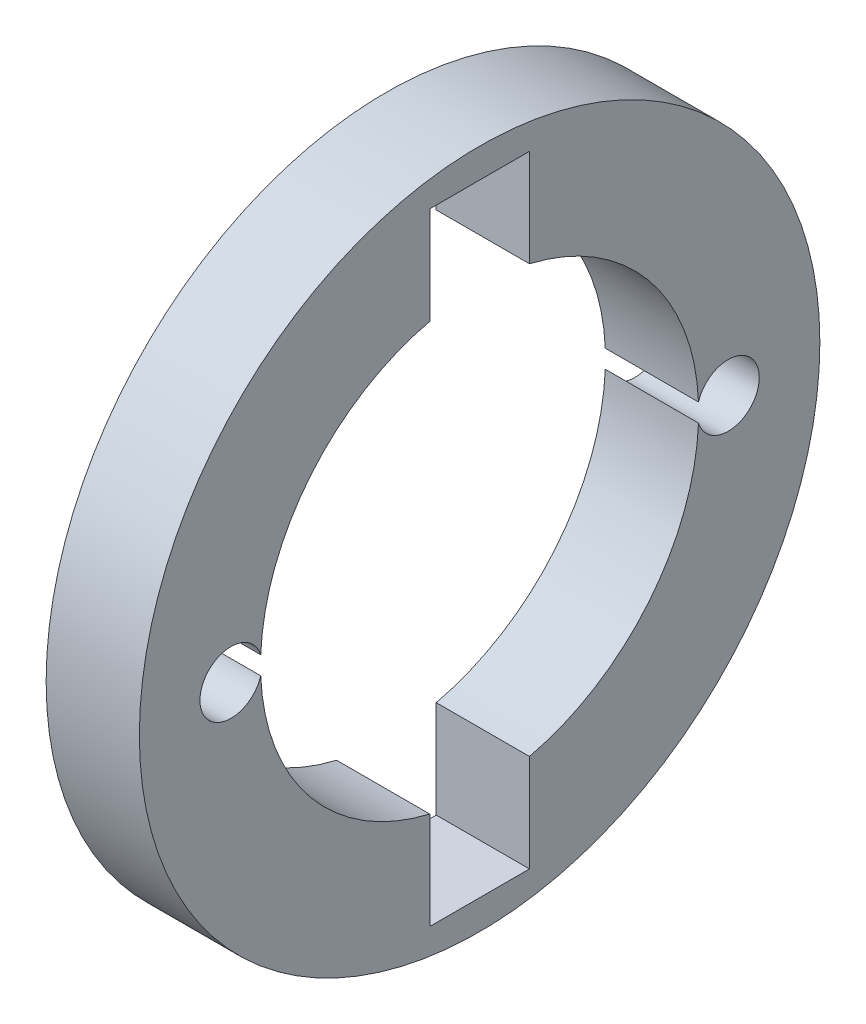
ISO-10303-21;
HEADER;
FILE_DESCRIPTION(('STEP AP214'),'2;1');
FILE_NAME('part.step','',(''),(''),'','','');
FILE_SCHEMA(('AUTOMOTIVE_DESIGN { 1 0 10303 214 1 1 1 1 }'));
ENDSEC;
DATA;
#1=APPLICATION_CONTEXT('core data for automotive mechanical design processes');
#2=APPLICATION_PROTOCOL_DEFINITION('international standard','automotive_design',2000,#1);
#3=PRODUCT_CONTEXT('',#1,'mechanical');
#4=PRODUCT('Part','Part','',(#3));
#5=PRODUCT_RELATED_PRODUCT_CATEGORY('part','',(#4));
#6=PRODUCT_DEFINITION_FORMATION('','',#4);
#7=PRODUCT_DEFINITION_CONTEXT('part definition',#1,'design');
#8=PRODUCT_DEFINITION('design','',#6,#7);
#9=PRODUCT_DEFINITION_SHAPE('','',#8);
#10=(LENGTH_UNIT() NAMED_UNIT(*) SI_UNIT(.MILLI.,.METRE.));
#11=(NAMED_UNIT(*) PLANE_ANGLE_UNIT() SI_UNIT($,.RADIAN.));
#12=(NAMED_UNIT(*) SI_UNIT($,.STERADIAN.) SOLID_ANGLE_UNIT());
#13=UNCERTAINTY_MEASURE_WITH_UNIT(LENGTH_MEASURE(1.E-05),#10,'distance_accuracy_value','');
#14=(GEOMETRIC_REPRESENTATION_CONTEXT(3) GLOBAL_UNCERTAINTY_ASSIGNED_CONTEXT((#13)) GLOBAL_UNIT_ASSIGNED_CONTEXT((#10,
#11,#12)) REPRESENTATION_CONTEXT('',''));
#15=CARTESIAN_POINT('',(0.,0.,0.));
#16=DIRECTION('',(0.,0.,1.));
#17=DIRECTION('',(1.,0.,0.));
#18=AXIS2_PLACEMENT_3D('',#15,#16,#17);
#19=CARTESIAN_POINT('',(-8.42,0.,0.));
#20=DIRECTION('',(1.,0.,0.));
#21=DIRECTION('',(0.,0.,-1.));
#22=AXIS2_PLACEMENT_3D('',#19,#20,#21);
#23=CYLINDRICAL_SURFACE('',#22,10.95);
#24=CARTESIAN_POINT('',(-8.42,0.,0.));
#25=DIRECTION('',(-1.,0.,0.));
#26=DIRECTION('',(0.,0.,1.));
#27=AXIS2_PLACEMENT_3D('',#24,#25,#26);
#28=CIRCLE('',#27,10.95);
#29=CARTESIAN_POINT('',(-8.42,0.,10.95));
#30=VERTEX_POINT('',#29);
#31=EDGE_CURVE('E206',#30,#30,#28,.T.);
#32=ORIENTED_EDGE('',*,*,#31,.F.);
#33=EDGE_LOOP('',(#32));
#34=FACE_BOUND('',#33,.T.);
#35=CARTESIAN_POINT('',(-5.42,0.,0.));
#36=DIRECTION('',(-1.,0.,0.));
#37=DIRECTION('',(0.,0.,1.));
#38=AXIS2_PLACEMENT_3D('',#35,#36,#37);
#39=CIRCLE('',#38,10.95);
#40=CARTESIAN_POINT('',(-5.42,0.,10.95));
#41=VERTEX_POINT('',#40);
#42=EDGE_CURVE('E210',#41,#41,#39,.T.);
#43=ORIENTED_EDGE('',*,*,#42,.T.);
#44=EDGE_LOOP('',(#43));
#45=FACE_BOUND('',#44,.T.);
#46=ADVANCED_FACE('F33',(#34,#45),#23,.T.);
#47=CARTESIAN_POINT('',(-8.42,0.,0.));
#48=DIRECTION('',(-1.,0.,0.));
#49=DIRECTION('',(0.,0.,1.));
#50=AXIS2_PLACEMENT_3D('',#47,#48,#49);
#51=PLANE('',#50);
#52=CARTESIAN_POINT('',(-8.42,0.,0.));
#53=DIRECTION('',(1.,0.,0.));
#54=DIRECTION('',(0.,0.,-1.));
#55=AXIS2_PLACEMENT_3D('',#52,#53,#54);
#56=CIRCLE('',#55,7.05);
#57=CARTESIAN_POINT('',(-8.42,6.864993450637,1.60448275862069));
#58=VERTEX_POINT('',#57);
#59=CARTESIAN_POINT('',(-8.42,0.293060985480737,7.04390625));
#60=VERTEX_POINT('',#59);
#61=EDGE_CURVE('E165',#58,#60,#56,.T.);
#62=ORIENTED_EDGE('',*,*,#61,.T.);
#63=CARTESIAN_POINT('',(-8.42,0.,8.));
#64=DIRECTION('',(-1.,0.,0.));
#65=DIRECTION('',(0.,0.,1.));
#66=AXIS2_PLACEMENT_3D('',#63,#64,#65);
#67=CIRCLE('',#66,1.);
#68=CARTESIAN_POINT('',(-8.42,-0.293060985480737,7.04390625));
#69=VERTEX_POINT('',#68);
#70=EDGE_CURVE('E186',#69,#60,#67,.T.);
#71=ORIENTED_EDGE('',*,*,#70,.F.);
#72=CARTESIAN_POINT('',(-8.42,-6.864993450637,1.60448275862069));
#73=VERTEX_POINT('',#72);
#74=EDGE_CURVE('E164',#69,#73,#56,.T.);
#75=ORIENTED_EDGE('',*,*,#74,.T.);
#76=DIRECTION('',(0.,-1.,0.));
#77=VECTOR('',#76,1.);
#78=CARTESIAN_POINT('',(-8.42,-10.,1.60448275862069));
#79=LINE('',#78,#77);
#80=CARTESIAN_POINT('',(-8.42,-10.,1.60448275862069));
#81=VERTEX_POINT('',#80);
#82=EDGE_CURVE('E133',#73,#81,#79,.T.);
#83=ORIENTED_EDGE('',*,*,#82,.T.);
#84=DIRECTION('',(0.,0.,-1.));
#85=VECTOR('',#84,1.);
#86=CARTESIAN_POINT('',(-8.42,-10.,1.60448275862069));
#87=LINE('',#86,#85);
#88=CARTESIAN_POINT('',(-8.42,-10.,-1.60448275862069));
#89=VERTEX_POINT('',#88);
#90=EDGE_CURVE('E125',#81,#89,#87,.T.);
#91=ORIENTED_EDGE('',*,*,#90,.T.);
#92=DIRECTION('',(0.,1.,0.));
#93=VECTOR('',#92,1.);
#94=CARTESIAN_POINT('',(-8.42,-10.,-1.60448275862069));
#95=LINE('',#94,#93);
#96=CARTESIAN_POINT('',(-8.42,-6.864993450637,-1.60448275862069));
#97=VERTEX_POINT('',#96);
#98=EDGE_CURVE('E136',#89,#97,#95,.T.);
#99=ORIENTED_EDGE('',*,*,#98,.T.);
#100=CARTESIAN_POINT('',(-8.42,0.,0.));
#101=DIRECTION('',(1.,0.,0.));
#102=DIRECTION('',(0.,0.,-1.));
#103=AXIS2_PLACEMENT_3D('',#100,#101,#102);
#104=CIRCLE('',#103,7.05);
#105=CARTESIAN_POINT('',(-8.42,-0.293060985480737,-7.04390625));
#106=VERTEX_POINT('',#105);
#107=EDGE_CURVE('E153',#97,#106,#104,.T.);
#108=ORIENTED_EDGE('',*,*,#107,.T.);
#109=CARTESIAN_POINT('',(-8.42,0.,-8.));
#110=DIRECTION('',(-1.,0.,0.));
#111=DIRECTION('',(0.,0.,1.));
#112=AXIS2_PLACEMENT_3D('',#109,#110,#111);
#113=CIRCLE('',#112,1.);
#114=CARTESIAN_POINT('',(-8.42,0.293060985480737,-7.04390625));
#115=VERTEX_POINT('',#114);
#116=EDGE_CURVE('E200',#115,#106,#113,.T.);
#117=ORIENTED_EDGE('',*,*,#116,.F.);
#118=CARTESIAN_POINT('',(-8.42,6.864993450637,-1.60448275862069));
#119=VERTEX_POINT('',#118);
#120=EDGE_CURVE('E55',#115,#119,#104,.T.);
#121=ORIENTED_EDGE('',*,*,#120,.T.);
#122=DIRECTION('',(0.,1.,0.));
#123=VECTOR('',#122,1.);
#124=CARTESIAN_POINT('',(-8.42,10.,-1.60448275862069));
#125=LINE('',#124,#123);
#126=CARTESIAN_POINT('',(-8.42,10.,-1.60448275862069));
#127=VERTEX_POINT('',#126);
#128=EDGE_CURVE('E155',#119,#127,#125,.T.);
#129=ORIENTED_EDGE('',*,*,#128,.T.);
#130=DIRECTION('',(0.,0.,1.));
#131=VECTOR('',#130,1.);
#132=CARTESIAN_POINT('',(-8.42,10.,1.60448275862069));
#133=LINE('',#132,#131);
#134=CARTESIAN_POINT('',(-8.42,10.,1.60448275862069));
#135=VERTEX_POINT('',#134);
#136=EDGE_CURVE('E158',#127,#135,#133,.T.);
#137=ORIENTED_EDGE('',*,*,#136,.T.);
#138=DIRECTION('',(0.,-1.,0.));
#139=VECTOR('',#138,1.);
#140=CARTESIAN_POINT('',(-8.42,10.,1.60448275862069));
#141=LINE('',#140,#139);
#142=EDGE_CURVE('E161',#135,#58,#141,.T.);
#143=ORIENTED_EDGE('',*,*,#142,.T.);
#144=EDGE_LOOP('',(#62,#71,#75,#83,#91,#99,#108,#117,#121,#129,#137,#143));
#145=FACE_BOUND('',#144,.T.);
#146=ORIENTED_EDGE('',*,*,#31,.T.);
#147=EDGE_LOOP('',(#146));
#148=FACE_BOUND('',#147,.T.);
#149=ADVANCED_FACE('F143',(#145,#148),#51,.T.);
#150=CARTESIAN_POINT('',(-5.42,0.,0.));
#151=DIRECTION('',(-1.,0.,0.));
#152=DIRECTION('',(0.,0.,1.));
#153=AXIS2_PLACEMENT_3D('',#150,#151,#152);
#154=PLANE('',#153);
#155=CARTESIAN_POINT('',(-5.42,0.,8.));
#156=DIRECTION('',(-1.,0.,0.));
#157=DIRECTION('',(0.,0.,1.));
#158=AXIS2_PLACEMENT_3D('',#155,#156,#157);
#159=CIRCLE('',#158,1.);
#160=CARTESIAN_POINT('',(-5.42,-0.293060985480737,7.04390625));
#161=VERTEX_POINT('',#160);
#162=CARTESIAN_POINT('',(-5.42,0.293060985480737,7.04390625));
#163=VERTEX_POINT('',#162);
#164=EDGE_CURVE('E203',#161,#163,#159,.T.);
#165=ORIENTED_EDGE('',*,*,#164,.T.);
#166=CARTESIAN_POINT('',(-5.42,0.,0.));
#167=DIRECTION('',(1.,0.,0.));
#168=DIRECTION('',(0.,0.,-1.));
#169=AXIS2_PLACEMENT_3D('',#166,#167,#168);
#170=CIRCLE('',#169,7.05);
#171=CARTESIAN_POINT('',(-5.42,6.864993450637,1.60448275862069));
#172=VERTEX_POINT('',#171);
#173=EDGE_CURVE('E150',#172,#163,#170,.T.);
#174=ORIENTED_EDGE('',*,*,#173,.F.);
#175=DIRECTION('',(0.,-1.,0.));
#176=VECTOR('',#175,1.);
#177=CARTESIAN_POINT('',(-5.42,10.,1.60448275862069));
#178=LINE('',#177,#176);
#179=CARTESIAN_POINT('',(-5.42,10.,1.60448275862069));
#180=VERTEX_POINT('',#179);
#181=EDGE_CURVE('E179',#180,#172,#178,.T.);
#182=ORIENTED_EDGE('',*,*,#181,.F.);
#183=DIRECTION('',(0.,0.,1.));
#184=VECTOR('',#183,1.);
#185=CARTESIAN_POINT('',(-5.42,10.,1.60448275862069));
#186=LINE('',#185,#184);
#187=CARTESIAN_POINT('',(-5.42,10.,-1.60448275862069));
#188=VERTEX_POINT('',#187);
#189=EDGE_CURVE('E176',#188,#180,#186,.T.);
#190=ORIENTED_EDGE('',*,*,#189,.F.);
#191=DIRECTION('',(0.,1.,0.));
#192=VECTOR('',#191,1.);
#193=CARTESIAN_POINT('',(-5.42,10.,-1.60448275862069));
#194=LINE('',#193,#192);
#195=CARTESIAN_POINT('',(-5.42,6.864993450637,-1.60448275862069));
#196=VERTEX_POINT('',#195);
#197=EDGE_CURVE('E173',#196,#188,#194,.T.);
#198=ORIENTED_EDGE('',*,*,#197,.F.);
#199=CARTESIAN_POINT('',(-5.42,0.,0.));
#200=DIRECTION('',(1.,0.,0.));
#201=DIRECTION('',(0.,0.,-1.));
#202=AXIS2_PLACEMENT_3D('',#199,#200,#201);
#203=CIRCLE('',#202,7.05);
#204=CARTESIAN_POINT('',(-5.42,0.293060985480737,-7.04390625));
#205=VERTEX_POINT('',#204);
#206=EDGE_CURVE('E171',#205,#196,#203,.T.);
#207=ORIENTED_EDGE('',*,*,#206,.F.);
#208=CARTESIAN_POINT('',(-5.42,0.,-8.));
#209=DIRECTION('',(-1.,0.,0.));
#210=DIRECTION('',(0.,0.,1.));
#211=AXIS2_PLACEMENT_3D('',#208,#209,#210);
#212=CIRCLE('',#211,1.);
#213=CARTESIAN_POINT('',(-5.42,-0.293060985480737,-7.04390625));
#214=VERTEX_POINT('',#213);
#215=EDGE_CURVE('E213',#205,#214,#212,.T.);
#216=ORIENTED_EDGE('',*,*,#215,.T.);
#217=CARTESIAN_POINT('',(-5.42,-6.864993450637,-1.60448275862069));
#218=VERTEX_POINT('',#217);
#219=EDGE_CURVE('E47',#218,#214,#203,.T.);
#220=ORIENTED_EDGE('',*,*,#219,.F.);
#221=DIRECTION('',(0.,1.,0.));
#222=VECTOR('',#221,1.);
#223=CARTESIAN_POINT('',(-5.42,-10.,-1.60448275862069));
#224=LINE('',#223,#222);
#225=CARTESIAN_POINT('',(-5.42,-10.,-1.60448275862069));
#226=VERTEX_POINT('',#225);
#227=EDGE_CURVE('E169',#226,#218,#224,.T.);
#228=ORIENTED_EDGE('',*,*,#227,.F.);
#229=DIRECTION('',(0.,0.,-1.));
#230=VECTOR('',#229,1.);
#231=CARTESIAN_POINT('',(-5.42,-10.,1.60448275862069));
#232=LINE('',#231,#230);
#233=CARTESIAN_POINT('',(-5.42,-10.,1.60448275862069));
#234=VERTEX_POINT('',#233);
#235=EDGE_CURVE('E128',#234,#226,#232,.T.);
#236=ORIENTED_EDGE('',*,*,#235,.F.);
#237=DIRECTION('',(0.,-1.,0.));
#238=VECTOR('',#237,1.);
#239=CARTESIAN_POINT('',(-5.42,-10.,1.60448275862069));
#240=LINE('',#239,#238);
#241=CARTESIAN_POINT('',(-5.42,-6.864993450637,1.60448275862069));
#242=VERTEX_POINT('',#241);
#243=EDGE_CURVE('E147',#242,#234,#240,.T.);
#244=ORIENTED_EDGE('',*,*,#243,.F.);
#245=EDGE_CURVE('E182',#161,#242,#170,.T.);
#246=ORIENTED_EDGE('',*,*,#245,.F.);
#247=EDGE_LOOP('',(#165,#174,#182,#190,#198,#207,#216,#220,#228,#236,#244,#246));
#248=FACE_BOUND('',#247,.T.);
#249=ORIENTED_EDGE('',*,*,#42,.F.);
#250=EDGE_LOOP('',(#249));
#251=FACE_BOUND('',#250,.T.);
#252=ADVANCED_FACE('F230',(#248,#251),#154,.F.);
#253=CARTESIAN_POINT('',(8.5,0.,8.));
#254=DIRECTION('',(-1.,0.,0.));
#255=DIRECTION('',(0.,0.,1.));
#256=AXIS2_PLACEMENT_3D('',#253,#254,#255);
#257=CYLINDRICAL_SURFACE('',#256,1.);
#258=ORIENTED_EDGE('',*,*,#164,.F.);
#259=DIRECTION('',(1.,0.,0.));
#260=VECTOR('',#259,1.);
#261=CARTESIAN_POINT('',(-6.92,-0.293060985480736,7.04390625));
#262=LINE('',#261,#260);
#263=EDGE_CURVE('E11',#161,#69,#262,.F.);
#264=ORIENTED_EDGE('',*,*,#263,.T.);
#265=ORIENTED_EDGE('',*,*,#70,.T.);
#266=DIRECTION('',(1.,0.,0.));
#267=VECTOR('',#266,1.);
#268=CARTESIAN_POINT('',(-6.92,0.293060985480736,7.04390625));
#269=LINE('',#268,#267);
#270=EDGE_CURVE('E40',#60,#163,#269,.T.);
#271=ORIENTED_EDGE('',*,*,#270,.T.);
#272=EDGE_LOOP('',(#258,#264,#265,#271));
#273=FACE_BOUND('',#272,.T.);
#274=ADVANCED_FACE('F223',(#273),#257,.F.);
#275=CARTESIAN_POINT('',(8.5,0.,-8.));
#276=DIRECTION('',(-1.,0.,0.));
#277=DIRECTION('',(0.,0.,1.));
#278=AXIS2_PLACEMENT_3D('',#275,#276,#277);
#279=CYLINDRICAL_SURFACE('',#278,1.);
#280=ORIENTED_EDGE('',*,*,#215,.F.);
#281=DIRECTION('',(1.,0.,0.));
#282=VECTOR('',#281,1.);
#283=CARTESIAN_POINT('',(-6.92,0.293060985480727,-7.04390625));
#284=LINE('',#283,#282);
#285=EDGE_CURVE('E219',#205,#115,#284,.F.);
#286=ORIENTED_EDGE('',*,*,#285,.T.);
#287=ORIENTED_EDGE('',*,*,#116,.T.);
#288=DIRECTION('',(1.,0.,0.));
#289=VECTOR('',#288,1.);
#290=CARTESIAN_POINT('',(-6.92,-0.293060985480727,-7.04390625));
#291=LINE('',#290,#289);
#292=EDGE_CURVE('E209',#106,#214,#291,.T.);
#293=ORIENTED_EDGE('',*,*,#292,.T.);
#294=EDGE_LOOP('',(#280,#286,#287,#293));
#295=FACE_BOUND('',#294,.T.);
#296=ADVANCED_FACE('F254',(#295),#279,.F.);
#297=CARTESIAN_POINT('',(-8.42,0.,0.));
#298=DIRECTION('',(1.,0.,0.));
#299=DIRECTION('',(0.,0.,-1.));
#300=AXIS2_PLACEMENT_3D('',#297,#298,#299);
#301=CYLINDRICAL_SURFACE('',#300,7.05);
#302=ORIENTED_EDGE('',*,*,#107,.F.);
#303=DIRECTION('',(1.,0.,0.));
#304=VECTOR('',#303,1.);
#305=CARTESIAN_POINT('',(-8.42,-6.864993450637,-1.60448275862069));
#306=LINE('',#305,#304);
#307=EDGE_CURVE('E132',#97,#218,#306,.T.);
#308=ORIENTED_EDGE('',*,*,#307,.T.);
#309=ORIENTED_EDGE('',*,*,#219,.T.);
#310=ORIENTED_EDGE('',*,*,#292,.F.);
#311=EDGE_LOOP('',(#302,#308,#309,#310));
#312=FACE_BOUND('',#311,.T.);
#313=ADVANCED_FACE('F256',(#312),#301,.F.);
#314=CARTESIAN_POINT('',(-8.42,-10.,-1.60448275862069));
#315=DIRECTION('',(0.,0.,-1.));
#316=DIRECTION('',(0.,1.,0.));
#317=AXIS2_PLACEMENT_3D('',#314,#315,#316);
#318=PLANE('',#317);
#319=ORIENTED_EDGE('',*,*,#227,.T.);
#320=ORIENTED_EDGE('',*,*,#307,.F.);
#321=ORIENTED_EDGE('',*,*,#98,.F.);
#322=DIRECTION('',(1.,0.,0.));
#323=VECTOR('',#322,1.);
#324=CARTESIAN_POINT('',(-8.42,-10.,-1.60448275862069));
#325=LINE('',#324,#323);
#326=EDGE_CURVE('E121',#89,#226,#325,.T.);
#327=ORIENTED_EDGE('',*,*,#326,.T.);
#328=EDGE_LOOP('',(#319,#320,#321,#327));
#329=FACE_BOUND('',#328,.T.);
#330=ADVANCED_FACE('F137',(#329),#318,.F.);
#331=CARTESIAN_POINT('',(-8.42,0.,0.));
#332=DIRECTION('',(1.,0.,0.));
#333=DIRECTION('',(0.,0.,-1.));
#334=AXIS2_PLACEMENT_3D('',#331,#332,#333);
#335=CYLINDRICAL_SURFACE('',#334,7.05);
#336=ORIENTED_EDGE('',*,*,#245,.T.);
#337=DIRECTION('',(1.,0.,0.));
#338=VECTOR('',#337,1.);
#339=CARTESIAN_POINT('',(-8.42,-6.864993450637,1.60448275862069));
#340=LINE('',#339,#338);
#341=EDGE_CURVE('E187',#73,#242,#340,.T.);
#342=ORIENTED_EDGE('',*,*,#341,.F.);
#343=ORIENTED_EDGE('',*,*,#74,.F.);
#344=ORIENTED_EDGE('',*,*,#263,.F.);
#345=EDGE_LOOP('',(#336,#342,#343,#344));
#346=FACE_BOUND('',#345,.T.);
#347=ADVANCED_FACE('F235',(#346),#335,.F.);
#348=CARTESIAN_POINT('',(-8.42,-10.,1.60448275862069));
#349=DIRECTION('',(0.,0.,1.));
#350=DIRECTION('',(0.,-1.,0.));
#351=AXIS2_PLACEMENT_3D('',#348,#349,#350);
#352=PLANE('',#351);
#353=ORIENTED_EDGE('',*,*,#243,.T.);
#354=DIRECTION('',(1.,0.,0.));
#355=VECTOR('',#354,1.);
#356=CARTESIAN_POINT('',(-8.42,-10.,1.60448275862069));
#357=LINE('',#356,#355);
#358=EDGE_CURVE('E184',#81,#234,#357,.T.);
#359=ORIENTED_EDGE('',*,*,#358,.F.);
#360=ORIENTED_EDGE('',*,*,#82,.F.);
#361=ORIENTED_EDGE('',*,*,#341,.T.);
#362=EDGE_LOOP('',(#353,#359,#360,#361));
#363=FACE_BOUND('',#362,.T.);
#364=ADVANCED_FACE('F237',(#363),#352,.F.);
#365=CARTESIAN_POINT('',(-8.42,-10.,1.60448275862069));
#366=DIRECTION('',(0.,-1.,0.));
#367=DIRECTION('',(0.,0.,-1.));
#368=AXIS2_PLACEMENT_3D('',#365,#366,#367);
#369=PLANE('',#368);
#370=ORIENTED_EDGE('',*,*,#235,.T.);
#371=ORIENTED_EDGE('',*,*,#326,.F.);
#372=ORIENTED_EDGE('',*,*,#90,.F.);
#373=ORIENTED_EDGE('',*,*,#358,.T.);
#374=EDGE_LOOP('',(#370,#371,#372,#373));
#375=FACE_BOUND('',#374,.T.);
#376=ADVANCED_FACE('F123',(#375),#369,.F.);
#377=ORIENTED_EDGE('',*,*,#61,.F.);
#378=DIRECTION('',(1.,0.,0.));
#379=VECTOR('',#378,1.);
#380=CARTESIAN_POINT('',(-8.42,6.864993450637,1.60448275862069));
#381=LINE('',#380,#379);
#382=EDGE_CURVE('E190',#58,#172,#381,.T.);
#383=ORIENTED_EDGE('',*,*,#382,.T.);
#384=ORIENTED_EDGE('',*,*,#173,.T.);
#385=ORIENTED_EDGE('',*,*,#270,.F.);
#386=EDGE_LOOP('',(#377,#383,#384,#385));
#387=FACE_BOUND('',#386,.T.);
#388=ADVANCED_FACE('F239',(#387),#335,.F.);
#389=ORIENTED_EDGE('',*,*,#206,.T.);
#390=DIRECTION('',(1.,0.,0.));
#391=VECTOR('',#390,1.);
#392=CARTESIAN_POINT('',(-8.42,6.864993450637,-1.60448275862069));
#393=LINE('',#392,#391);
#394=EDGE_CURVE('E196',#119,#196,#393,.T.);
#395=ORIENTED_EDGE('',*,*,#394,.F.);
#396=ORIENTED_EDGE('',*,*,#120,.F.);
#397=ORIENTED_EDGE('',*,*,#285,.F.);
#398=EDGE_LOOP('',(#389,#395,#396,#397));
#399=FACE_BOUND('',#398,.T.);
#400=ADVANCED_FACE('F251',(#399),#301,.F.);
#401=CARTESIAN_POINT('',(-8.42,10.,1.60448275862069));
#402=DIRECTION('',(0.,0.,1.));
#403=DIRECTION('',(0.,-1.,0.));
#404=AXIS2_PLACEMENT_3D('',#401,#402,#403);
#405=PLANE('',#404);
#406=ORIENTED_EDGE('',*,*,#181,.T.);
#407=ORIENTED_EDGE('',*,*,#382,.F.);
#408=ORIENTED_EDGE('',*,*,#142,.F.);
#409=DIRECTION('',(1.,0.,0.));
#410=VECTOR('',#409,1.);
#411=CARTESIAN_POINT('',(-8.42,10.,1.60448275862069));
#412=LINE('',#411,#410);
#413=EDGE_CURVE('E192',#135,#180,#412,.T.);
#414=ORIENTED_EDGE('',*,*,#413,.T.);
#415=EDGE_LOOP('',(#406,#407,#408,#414));
#416=FACE_BOUND('',#415,.T.);
#417=ADVANCED_FACE('F241',(#416),#405,.F.);
#418=CARTESIAN_POINT('',(-8.42,10.,1.60448275862069));
#419=DIRECTION('',(0.,1.,0.));
#420=DIRECTION('',(0.,0.,1.));
#421=AXIS2_PLACEMENT_3D('',#418,#419,#420);
#422=PLANE('',#421);
#423=ORIENTED_EDGE('',*,*,#189,.T.);
#424=ORIENTED_EDGE('',*,*,#413,.F.);
#425=ORIENTED_EDGE('',*,*,#136,.F.);
#426=DIRECTION('',(1.,0.,0.));
#427=VECTOR('',#426,1.);
#428=CARTESIAN_POINT('',(-8.42,10.,-1.60448275862069));
#429=LINE('',#428,#427);
#430=EDGE_CURVE('E194',#127,#188,#429,.T.);
#431=ORIENTED_EDGE('',*,*,#430,.T.);
#432=EDGE_LOOP('',(#423,#424,#425,#431));
#433=FACE_BOUND('',#432,.T.);
#434=ADVANCED_FACE('F246',(#433),#422,.F.);
#435=CARTESIAN_POINT('',(-8.42,10.,-1.60448275862069));
#436=DIRECTION('',(0.,0.,-1.));
#437=DIRECTION('',(0.,1.,0.));
#438=AXIS2_PLACEMENT_3D('',#435,#436,#437);
#439=PLANE('',#438);
#440=ORIENTED_EDGE('',*,*,#197,.T.);
#441=ORIENTED_EDGE('',*,*,#430,.F.);
#442=ORIENTED_EDGE('',*,*,#128,.F.);
#443=ORIENTED_EDGE('',*,*,#394,.T.);
#444=EDGE_LOOP('',(#440,#441,#442,#443));
#445=FACE_BOUND('',#444,.T.);
#446=ADVANCED_FACE('F250',(#445),#439,.F.);
#447=CLOSED_SHELL('',(#46,#149,#252,#274,#296,#313,#330,#347,#364,#376,#388,#400,#417,#434,#446));
#448=MANIFOLD_SOLID_BREP('B2',#447);
#449=ADVANCED_BREP_SHAPE_REPRESENTATION('',(#18,#448),#14);
#450=SHAPE_DEFINITION_REPRESENTATION(#9,#449);
ENDSEC;
END-ISO-10303-21;
